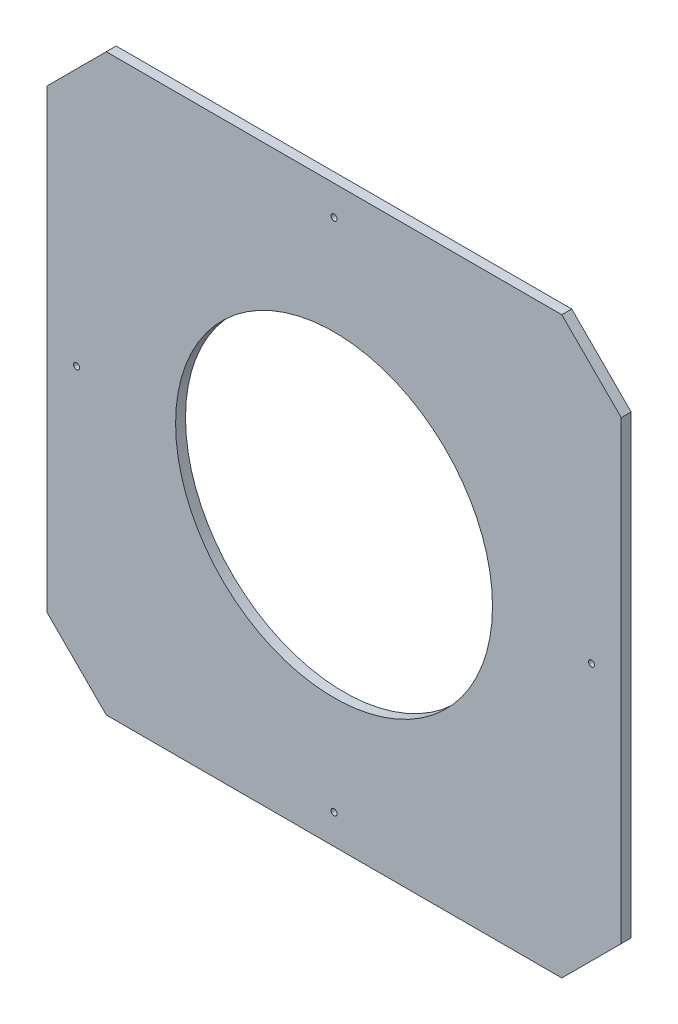
ISO-10303-21;
HEADER;
FILE_DESCRIPTION(('STEP AP214'),'2;1');
FILE_NAME('part.step','',(''),(''),'','','');
FILE_SCHEMA(('AUTOMOTIVE_DESIGN { 1 0 10303 214 1 1 1 1 }'));
ENDSEC;
DATA;
#1=APPLICATION_CONTEXT('core data for automotive mechanical design processes');
#2=APPLICATION_PROTOCOL_DEFINITION('international standard','automotive_design',2000,#1);
#3=PRODUCT_CONTEXT('',#1,'mechanical');
#4=PRODUCT('Part','Part','',(#3));
#5=PRODUCT_RELATED_PRODUCT_CATEGORY('part','',(#4));
#6=PRODUCT_DEFINITION_FORMATION('','',#4);
#7=PRODUCT_DEFINITION_CONTEXT('part definition',#1,'design');
#8=PRODUCT_DEFINITION('design','',#6,#7);
#9=PRODUCT_DEFINITION_SHAPE('','',#8);
#10=(LENGTH_UNIT() NAMED_UNIT(*) SI_UNIT(.MILLI.,.METRE.));
#11=(NAMED_UNIT(*) PLANE_ANGLE_UNIT() SI_UNIT($,.RADIAN.));
#12=(NAMED_UNIT(*) SI_UNIT($,.STERADIAN.) SOLID_ANGLE_UNIT());
#13=UNCERTAINTY_MEASURE_WITH_UNIT(LENGTH_MEASURE(1.E-05),#10,'distance_accuracy_value','');
#14=(GEOMETRIC_REPRESENTATION_CONTEXT(3) GLOBAL_UNCERTAINTY_ASSIGNED_CONTEXT((#13)) GLOBAL_UNIT_ASSIGNED_CONTEXT((#10,
#11,#12)) REPRESENTATION_CONTEXT('',''));
#15=CARTESIAN_POINT('',(0.,0.,0.));
#16=DIRECTION('',(0.,0.,1.));
#17=DIRECTION('',(1.,0.,0.));
#18=AXIS2_PLACEMENT_3D('',#15,#16,#17);
#19=CARTESIAN_POINT('',(-130.,130.,5.));
#20=DIRECTION('',(-0.707106781186548,0.707106781186548,0.));
#21=DIRECTION('',(-0.707106781186548,-0.707106781186548,0.));
#22=AXIS2_PLACEMENT_3D('',#19,#20,#21);
#23=PLANE('',#22);
#24=DIRECTION('',(0.707106781186548,0.707106781186548,0.));
#25=VECTOR('',#24,1.);
#26=CARTESIAN_POINT('',(-130.,130.,0.));
#27=LINE('',#26,#25);
#28=CARTESIAN_POINT('',(-145.,115.,0.));
#29=VERTEX_POINT('',#28);
#30=CARTESIAN_POINT('',(-115.,145.,0.));
#31=VERTEX_POINT('',#30);
#32=EDGE_CURVE('E135',#29,#31,#27,.T.);
#33=ORIENTED_EDGE('',*,*,#32,.F.);
#34=DIRECTION('',(0.,0.,-1.));
#35=VECTOR('',#34,1.);
#36=CARTESIAN_POINT('',(-145.,115.,5.));
#37=LINE('',#36,#35);
#38=CARTESIAN_POINT('',(-145.,115.,5.));
#39=VERTEX_POINT('',#38);
#40=EDGE_CURVE('E11',#39,#29,#37,.T.);
#41=ORIENTED_EDGE('',*,*,#40,.F.);
#42=DIRECTION('',(0.707106781186548,0.707106781186548,0.));
#43=VECTOR('',#42,1.);
#44=CARTESIAN_POINT('',(-130.,130.,5.));
#45=LINE('',#44,#43);
#46=CARTESIAN_POINT('',(-115.,145.,5.));
#47=VERTEX_POINT('',#46);
#48=EDGE_CURVE('E200',#39,#47,#45,.T.);
#49=ORIENTED_EDGE('',*,*,#48,.T.);
#50=DIRECTION('',(0.,0.,-1.));
#51=VECTOR('',#50,1.);
#52=CARTESIAN_POINT('',(-115.,145.,5.));
#53=LINE('',#52,#51);
#54=EDGE_CURVE('E55',#47,#31,#53,.T.);
#55=ORIENTED_EDGE('',*,*,#54,.T.);
#56=EDGE_LOOP('',(#33,#41,#49,#55));
#57=FACE_BOUND('',#56,.T.);
#58=ADVANCED_FACE('F36',(#57),#23,.T.);
#59=CARTESIAN_POINT('',(-145.,0.,5.));
#60=DIRECTION('',(1.,0.,0.));
#61=DIRECTION('',(0.,0.,-1.));
#62=AXIS2_PLACEMENT_3D('',#59,#60,#61);
#63=PLANE('',#62);
#64=DIRECTION('',(0.,-1.,0.));
#65=VECTOR('',#64,1.);
#66=CARTESIAN_POINT('',(-145.,0.,0.));
#67=LINE('',#66,#65);
#68=CARTESIAN_POINT('',(-145.,-115.,0.));
#69=VERTEX_POINT('',#68);
#70=EDGE_CURVE('E138',#29,#69,#67,.T.);
#71=ORIENTED_EDGE('',*,*,#70,.T.);
#72=DIRECTION('',(0.,0.,-1.));
#73=VECTOR('',#72,1.);
#74=CARTESIAN_POINT('',(-145.,-115.,5.));
#75=LINE('',#74,#73);
#76=CARTESIAN_POINT('',(-145.,-115.,5.));
#77=VERTEX_POINT('',#76);
#78=EDGE_CURVE('E46',#77,#69,#75,.T.);
#79=ORIENTED_EDGE('',*,*,#78,.F.);
#80=DIRECTION('',(0.,-1.,0.));
#81=VECTOR('',#80,1.);
#82=CARTESIAN_POINT('',(-145.,0.,5.));
#83=LINE('',#82,#81);
#84=EDGE_CURVE('E202',#39,#77,#83,.T.);
#85=ORIENTED_EDGE('',*,*,#84,.F.);
#86=ORIENTED_EDGE('',*,*,#40,.T.);
#87=EDGE_LOOP('',(#71,#79,#85,#86));
#88=FACE_BOUND('',#87,.T.);
#89=ADVANCED_FACE('F231',(#88),#63,.F.);
#90=CARTESIAN_POINT('',(-130.,-130.,5.));
#91=DIRECTION('',(0.707106781186548,0.707106781186548,0.));
#92=DIRECTION('',(-0.707106781186548,0.707106781186548,0.));
#93=AXIS2_PLACEMENT_3D('',#90,#91,#92);
#94=PLANE('',#93);
#95=DIRECTION('',(0.707106781186548,-0.707106781186548,0.));
#96=VECTOR('',#95,1.);
#97=CARTESIAN_POINT('',(-130.,-130.,0.));
#98=LINE('',#97,#96);
#99=CARTESIAN_POINT('',(-115.,-145.,0.));
#100=VERTEX_POINT('',#99);
#101=EDGE_CURVE('E141',#69,#100,#98,.T.);
#102=ORIENTED_EDGE('',*,*,#101,.T.);
#103=DIRECTION('',(0.,0.,-1.));
#104=VECTOR('',#103,1.);
#105=CARTESIAN_POINT('',(-115.,-145.,5.));
#106=LINE('',#105,#104);
#107=CARTESIAN_POINT('',(-115.,-145.,5.));
#108=VERTEX_POINT('',#107);
#109=EDGE_CURVE('E163',#108,#100,#106,.T.);
#110=ORIENTED_EDGE('',*,*,#109,.F.);
#111=DIRECTION('',(0.707106781186548,-0.707106781186548,0.));
#112=VECTOR('',#111,1.);
#113=CARTESIAN_POINT('',(-130.,-130.,5.));
#114=LINE('',#113,#112);
#115=EDGE_CURVE('E205',#77,#108,#114,.T.);
#116=ORIENTED_EDGE('',*,*,#115,.F.);
#117=ORIENTED_EDGE('',*,*,#78,.T.);
#118=EDGE_LOOP('',(#102,#110,#116,#117));
#119=FACE_BOUND('',#118,.T.);
#120=ADVANCED_FACE('F235',(#119),#94,.F.);
#121=CARTESIAN_POINT('',(0.,-145.,5.));
#122=DIRECTION('',(0.,1.,0.));
#123=DIRECTION('',(0.,0.,1.));
#124=AXIS2_PLACEMENT_3D('',#121,#122,#123);
#125=PLANE('',#124);
#126=DIRECTION('',(1.,0.,0.));
#127=VECTOR('',#126,1.);
#128=CARTESIAN_POINT('',(0.,-145.,0.));
#129=LINE('',#128,#127);
#130=CARTESIAN_POINT('',(115.,-145.,0.));
#131=VERTEX_POINT('',#130);
#132=EDGE_CURVE('E144',#100,#131,#129,.T.);
#133=ORIENTED_EDGE('',*,*,#132,.T.);
#134=DIRECTION('',(0.,0.,-1.));
#135=VECTOR('',#134,1.);
#136=CARTESIAN_POINT('',(115.,-145.,5.));
#137=LINE('',#136,#135);
#138=CARTESIAN_POINT('',(115.,-145.,5.));
#139=VERTEX_POINT('',#138);
#140=EDGE_CURVE('E160',#139,#131,#137,.T.);
#141=ORIENTED_EDGE('',*,*,#140,.F.);
#142=DIRECTION('',(1.,0.,0.));
#143=VECTOR('',#142,1.);
#144=CARTESIAN_POINT('',(0.,-145.,5.));
#145=LINE('',#144,#143);
#146=EDGE_CURVE('E208',#108,#139,#145,.T.);
#147=ORIENTED_EDGE('',*,*,#146,.F.);
#148=ORIENTED_EDGE('',*,*,#109,.T.);
#149=EDGE_LOOP('',(#133,#141,#147,#148));
#150=FACE_BOUND('',#149,.T.);
#151=ADVANCED_FACE('F212',(#150),#125,.F.);
#152=CARTESIAN_POINT('',(130.,-130.,5.));
#153=DIRECTION('',(-0.707106781186548,0.707106781186548,0.));
#154=DIRECTION('',(-0.707106781186548,-0.707106781186548,0.));
#155=AXIS2_PLACEMENT_3D('',#152,#153,#154);
#156=PLANE('',#155);
#157=DIRECTION('',(0.707106781186548,0.707106781186548,0.));
#158=VECTOR('',#157,1.);
#159=CARTESIAN_POINT('',(130.,-130.,0.));
#160=LINE('',#159,#158);
#161=CARTESIAN_POINT('',(145.,-115.,0.));
#162=VERTEX_POINT('',#161);
#163=EDGE_CURVE('E147',#131,#162,#160,.T.);
#164=ORIENTED_EDGE('',*,*,#163,.T.);
#165=DIRECTION('',(0.,0.,-1.));
#166=VECTOR('',#165,1.);
#167=CARTESIAN_POINT('',(145.,-115.,5.));
#168=LINE('',#167,#166);
#169=CARTESIAN_POINT('',(145.,-115.,5.));
#170=VERTEX_POINT('',#169);
#171=EDGE_CURVE('E114',#170,#162,#168,.T.);
#172=ORIENTED_EDGE('',*,*,#171,.F.);
#173=DIRECTION('',(0.707106781186548,0.707106781186548,0.));
#174=VECTOR('',#173,1.);
#175=CARTESIAN_POINT('',(130.,-130.,5.));
#176=LINE('',#175,#174);
#177=EDGE_CURVE('E123',#139,#170,#176,.T.);
#178=ORIENTED_EDGE('',*,*,#177,.F.);
#179=ORIENTED_EDGE('',*,*,#140,.T.);
#180=EDGE_LOOP('',(#164,#172,#178,#179));
#181=FACE_BOUND('',#180,.T.);
#182=ADVANCED_FACE('F214',(#181),#156,.F.);
#183=CARTESIAN_POINT('',(145.,0.,5.));
#184=DIRECTION('',(1.,0.,0.));
#185=DIRECTION('',(0.,1.,0.));
#186=AXIS2_PLACEMENT_3D('',#183,#184,#185);
#187=PLANE('',#186);
#188=DIRECTION('',(0.,-1.,0.));
#189=VECTOR('',#188,1.);
#190=CARTESIAN_POINT('',(145.,0.,0.));
#191=LINE('',#190,#189);
#192=CARTESIAN_POINT('',(145.,115.,0.));
#193=VERTEX_POINT('',#192);
#194=EDGE_CURVE('E110',#193,#162,#191,.T.);
#195=ORIENTED_EDGE('',*,*,#194,.F.);
#196=DIRECTION('',(0.,0.,-1.));
#197=VECTOR('',#196,1.);
#198=CARTESIAN_POINT('',(145.,115.,5.));
#199=LINE('',#198,#197);
#200=CARTESIAN_POINT('',(145.,115.,5.));
#201=VERTEX_POINT('',#200);
#202=EDGE_CURVE('E105',#201,#193,#199,.T.);
#203=ORIENTED_EDGE('',*,*,#202,.F.);
#204=DIRECTION('',(0.,-1.,0.));
#205=VECTOR('',#204,1.);
#206=CARTESIAN_POINT('',(145.,0.,5.));
#207=LINE('',#206,#205);
#208=EDGE_CURVE('E108',#201,#170,#207,.T.);
#209=ORIENTED_EDGE('',*,*,#208,.T.);
#210=ORIENTED_EDGE('',*,*,#171,.T.);
#211=EDGE_LOOP('',(#195,#203,#209,#210));
#212=FACE_BOUND('',#211,.T.);
#213=ADVANCED_FACE('F107',(#212),#187,.T.);
#214=CARTESIAN_POINT('',(130.,130.,5.));
#215=DIRECTION('',(0.707106781186548,0.707106781186548,0.));
#216=DIRECTION('',(-0.707106781186548,0.707106781186548,0.));
#217=AXIS2_PLACEMENT_3D('',#214,#215,#216);
#218=PLANE('',#217);
#219=DIRECTION('',(0.707106781186548,-0.707106781186548,0.));
#220=VECTOR('',#219,1.);
#221=CARTESIAN_POINT('',(130.,130.,0.));
#222=LINE('',#221,#220);
#223=CARTESIAN_POINT('',(115.,145.,0.));
#224=VERTEX_POINT('',#223);
#225=EDGE_CURVE('E151',#224,#193,#222,.T.);
#226=ORIENTED_EDGE('',*,*,#225,.F.);
#227=DIRECTION('',(0.,0.,-1.));
#228=VECTOR('',#227,1.);
#229=CARTESIAN_POINT('',(115.,145.,5.));
#230=LINE('',#229,#228);
#231=CARTESIAN_POINT('',(115.,145.,5.));
#232=VERTEX_POINT('',#231);
#233=EDGE_CURVE('E80',#232,#224,#230,.T.);
#234=ORIENTED_EDGE('',*,*,#233,.F.);
#235=DIRECTION('',(0.707106781186548,-0.707106781186548,0.));
#236=VECTOR('',#235,1.);
#237=CARTESIAN_POINT('',(130.,130.,5.));
#238=LINE('',#237,#236);
#239=EDGE_CURVE('E121',#232,#201,#238,.T.);
#240=ORIENTED_EDGE('',*,*,#239,.T.);
#241=ORIENTED_EDGE('',*,*,#202,.T.);
#242=EDGE_LOOP('',(#226,#234,#240,#241));
#243=FACE_BOUND('',#242,.T.);
#244=ADVANCED_FACE('F126',(#243),#218,.T.);
#245=CARTESIAN_POINT('',(0.,0.,5.));
#246=DIRECTION('',(0.,0.,-1.));
#247=DIRECTION('',(-1.,0.,0.));
#248=AXIS2_PLACEMENT_3D('',#245,#246,#247);
#249=CYLINDRICAL_SURFACE('',#248,80.);
#250=CARTESIAN_POINT('',(0.,0.,5.));
#251=DIRECTION('',(0.,0.,1.));
#252=DIRECTION('',(1.,0.,0.));
#253=AXIS2_PLACEMENT_3D('',#250,#251,#252);
#254=CIRCLE('',#253,80.);
#255=CARTESIAN_POINT('',(80.,0.,5.));
#256=VERTEX_POINT('',#255);
#257=EDGE_CURVE('E156',#256,#256,#254,.T.);
#258=ORIENTED_EDGE('',*,*,#257,.T.);
#259=EDGE_LOOP('',(#258));
#260=FACE_BOUND('',#259,.T.);
#261=CARTESIAN_POINT('',(0.,0.,0.));
#262=DIRECTION('',(0.,0.,1.));
#263=DIRECTION('',(1.,0.,0.));
#264=AXIS2_PLACEMENT_3D('',#261,#262,#263);
#265=CIRCLE('',#264,80.);
#266=CARTESIAN_POINT('',(80.,0.,0.));
#267=VERTEX_POINT('',#266);
#268=EDGE_CURVE('E132',#267,#267,#265,.T.);
#269=ORIENTED_EDGE('',*,*,#268,.F.);
#270=EDGE_LOOP('',(#269));
#271=FACE_BOUND('',#270,.T.);
#272=ADVANCED_FACE('F38',(#260,#271),#249,.F.);
#273=CARTESIAN_POINT('',(0.,145.,5.));
#274=DIRECTION('',(0.,1.,0.));
#275=DIRECTION('',(0.,0.,1.));
#276=AXIS2_PLACEMENT_3D('',#273,#274,#275);
#277=PLANE('',#276);
#278=DIRECTION('',(1.,0.,0.));
#279=VECTOR('',#278,1.);
#280=CARTESIAN_POINT('',(0.,145.,0.));
#281=LINE('',#280,#279);
#282=EDGE_CURVE('E153',#31,#224,#281,.T.);
#283=ORIENTED_EDGE('',*,*,#282,.F.);
#284=ORIENTED_EDGE('',*,*,#54,.F.);
#285=DIRECTION('',(1.,0.,0.));
#286=VECTOR('',#285,1.);
#287=CARTESIAN_POINT('',(0.,145.,5.));
#288=LINE('',#287,#286);
#289=EDGE_CURVE('E127',#47,#232,#288,.T.);
#290=ORIENTED_EDGE('',*,*,#289,.T.);
#291=ORIENTED_EDGE('',*,*,#233,.T.);
#292=EDGE_LOOP('',(#283,#284,#290,#291));
#293=FACE_BOUND('',#292,.T.);
#294=ADVANCED_FACE('F218',(#293),#277,.T.);
#295=CARTESIAN_POINT('',(0.,0.,5.));
#296=DIRECTION('',(0.,0.,1.));
#297=DIRECTION('',(1.,0.,0.));
#298=AXIS2_PLACEMENT_3D('',#295,#296,#297);
#299=PLANE('',#298);
#300=CARTESIAN_POINT('',(0.,130.,5.));
#301=DIRECTION('',(0.,0.,1.));
#302=DIRECTION('',(1.,0.,0.));
#303=AXIS2_PLACEMENT_3D('',#300,#301,#302);
#304=CIRCLE('',#303,1.525);
#305=CARTESIAN_POINT('',(1.525,130.,5.));
#306=VERTEX_POINT('',#305);
#307=EDGE_CURVE('E368',#306,#306,#304,.T.);
#308=ORIENTED_EDGE('',*,*,#307,.F.);
#309=EDGE_LOOP('',(#308));
#310=FACE_BOUND('',#309,.T.);
#311=CARTESIAN_POINT('',(130.000000000007,7.36576383932167E-12,5.));
#312=DIRECTION('',(0.,0.,1.));
#313=DIRECTION('',(1.,0.,0.));
#314=AXIS2_PLACEMENT_3D('',#311,#312,#313);
#315=CIRCLE('',#314,1.525);
#316=CARTESIAN_POINT('',(131.525000000007,7.36576383932167E-12,5.));
#317=VERTEX_POINT('',#316);
#318=EDGE_CURVE('E184',#317,#317,#315,.T.);
#319=ORIENTED_EDGE('',*,*,#318,.F.);
#320=EDGE_LOOP('',(#319));
#321=FACE_BOUND('',#320,.T.);
#322=CARTESIAN_POINT('',(1.47315276786433E-11,-130.,5.));
#323=DIRECTION('',(0.,0.,1.));
#324=DIRECTION('',(1.,0.,0.));
#325=AXIS2_PLACEMENT_3D('',#322,#323,#324);
#326=CIRCLE('',#325,1.525);
#327=CARTESIAN_POINT('',(1.52500000001473,-130.,5.));
#328=VERTEX_POINT('',#327);
#329=EDGE_CURVE('E177',#328,#328,#326,.T.);
#330=ORIENTED_EDGE('',*,*,#329,.F.);
#331=EDGE_LOOP('',(#330));
#332=FACE_BOUND('',#331,.T.);
#333=CARTESIAN_POINT('',(-129.999999999993,-7.34984343093275E-12,5.));
#334=DIRECTION('',(0.,0.,1.));
#335=DIRECTION('',(1.,0.,0.));
#336=AXIS2_PLACEMENT_3D('',#333,#334,#335);
#337=CIRCLE('',#336,1.525);
#338=CARTESIAN_POINT('',(-128.474999999993,-7.34984343093275E-12,5.));
#339=VERTEX_POINT('',#338);
#340=EDGE_CURVE('E173',#339,#339,#337,.T.);
#341=ORIENTED_EDGE('',*,*,#340,.F.);
#342=EDGE_LOOP('',(#341));
#343=FACE_BOUND('',#342,.T.);
#344=ORIENTED_EDGE('',*,*,#257,.F.);
#345=EDGE_LOOP('',(#344));
#346=FACE_BOUND('',#345,.T.);
#347=ORIENTED_EDGE('',*,*,#48,.F.);
#348=ORIENTED_EDGE('',*,*,#84,.T.);
#349=ORIENTED_EDGE('',*,*,#115,.T.);
#350=ORIENTED_EDGE('',*,*,#146,.T.);
#351=ORIENTED_EDGE('',*,*,#177,.T.);
#352=ORIENTED_EDGE('',*,*,#208,.F.);
#353=ORIENTED_EDGE('',*,*,#239,.F.);
#354=ORIENTED_EDGE('',*,*,#289,.F.);
#355=EDGE_LOOP('',(#347,#348,#349,#350,#351,#352,#353,#354));
#356=FACE_BOUND('',#355,.T.);
#357=ADVANCED_FACE('F119',(#310,#321,#332,#343,#346,#356),#299,.T.);
#358=CARTESIAN_POINT('',(0.,0.,0.));
#359=DIRECTION('',(0.,0.,1.));
#360=DIRECTION('',(1.,0.,0.));
#361=AXIS2_PLACEMENT_3D('',#358,#359,#360);
#362=PLANE('',#361);
#363=CARTESIAN_POINT('',(0.,130.,0.));
#364=DIRECTION('',(0.,0.,1.));
#365=DIRECTION('',(1.,0.,0.));
#366=AXIS2_PLACEMENT_3D('',#363,#364,#365);
#367=CIRCLE('',#366,1.5);
#368=CARTESIAN_POINT('',(1.5,130.,0.));
#369=VERTEX_POINT('',#368);
#370=EDGE_CURVE('E40',#369,#369,#367,.T.);
#371=ORIENTED_EDGE('',*,*,#370,.T.);
#372=EDGE_LOOP('',(#371));
#373=FACE_BOUND('',#372,.T.);
#374=CARTESIAN_POINT('',(130.000000000007,7.36576383932167E-12,0.));
#375=DIRECTION('',(0.,0.,1.));
#376=DIRECTION('',(1.,0.,0.));
#377=AXIS2_PLACEMENT_3D('',#374,#375,#376);
#378=CIRCLE('',#377,1.5);
#379=CARTESIAN_POINT('',(131.500000000007,7.36576383932167E-12,0.));
#380=VERTEX_POINT('',#379);
#381=EDGE_CURVE('E175',#380,#380,#378,.T.);
#382=ORIENTED_EDGE('',*,*,#381,.T.);
#383=EDGE_LOOP('',(#382));
#384=FACE_BOUND('',#383,.T.);
#385=CARTESIAN_POINT('',(1.47315276786433E-11,-130.,0.));
#386=DIRECTION('',(0.,0.,1.));
#387=DIRECTION('',(1.,0.,0.));
#388=AXIS2_PLACEMENT_3D('',#385,#386,#387);
#389=CIRCLE('',#388,1.5);
#390=CARTESIAN_POINT('',(1.50000000001473,-130.,0.));
#391=VERTEX_POINT('',#390);
#392=EDGE_CURVE('E171',#391,#391,#389,.T.);
#393=ORIENTED_EDGE('',*,*,#392,.T.);
#394=EDGE_LOOP('',(#393));
#395=FACE_BOUND('',#394,.T.);
#396=CARTESIAN_POINT('',(-129.999999999993,-7.34984343093275E-12,0.));
#397=DIRECTION('',(0.,0.,1.));
#398=DIRECTION('',(1.,0.,0.));
#399=AXIS2_PLACEMENT_3D('',#396,#397,#398);
#400=CIRCLE('',#399,1.5);
#401=CARTESIAN_POINT('',(-128.499999999993,-7.34984343093275E-12,0.));
#402=VERTEX_POINT('',#401);
#403=EDGE_CURVE('E136',#402,#402,#400,.T.);
#404=ORIENTED_EDGE('',*,*,#403,.T.);
#405=EDGE_LOOP('',(#404));
#406=FACE_BOUND('',#405,.T.);
#407=ORIENTED_EDGE('',*,*,#268,.T.);
#408=EDGE_LOOP('',(#407));
#409=FACE_BOUND('',#408,.T.);
#410=ORIENTED_EDGE('',*,*,#32,.T.);
#411=ORIENTED_EDGE('',*,*,#282,.T.);
#412=ORIENTED_EDGE('',*,*,#225,.T.);
#413=ORIENTED_EDGE('',*,*,#194,.T.);
#414=ORIENTED_EDGE('',*,*,#163,.F.);
#415=ORIENTED_EDGE('',*,*,#132,.F.);
#416=ORIENTED_EDGE('',*,*,#101,.F.);
#417=ORIENTED_EDGE('',*,*,#70,.F.);
#418=EDGE_LOOP('',(#410,#411,#412,#413,#414,#415,#416,#417));
#419=FACE_BOUND('',#418,.T.);
#420=ADVANCED_FACE('F216',(#373,#384,#395,#406,#409,#419),#362,.F.);
#421=CARTESIAN_POINT('',(-129.999999999993,-7.34984343093275E-12,5.));
#422=DIRECTION('',(0.,0.,1.));
#423=DIRECTION('',(1.,0.,0.));
#424=AXIS2_PLACEMENT_3D('',#421,#422,#423);
#425=CYLINDRICAL_SURFACE('',#424,1.5);
#426=CARTESIAN_POINT('',(-129.999999999993,-7.34984343093275E-12,4.975));
#427=DIRECTION('',(0.,0.,1.));
#428=DIRECTION('',(1.,0.,0.));
#429=AXIS2_PLACEMENT_3D('',#426,#427,#428);
#430=CIRCLE('',#429,1.5);
#431=CARTESIAN_POINT('',(-128.499999999993,-7.34984343093275E-12,4.975));
#432=VERTEX_POINT('',#431);
#433=EDGE_CURVE('E170',#432,#432,#430,.T.);
#434=ORIENTED_EDGE('',*,*,#433,.T.);
#435=EDGE_LOOP('',(#434));
#436=FACE_BOUND('',#435,.T.);
#437=ORIENTED_EDGE('',*,*,#403,.F.);
#438=EDGE_LOOP('',(#437));
#439=FACE_BOUND('',#438,.T.);
#440=ADVANCED_FACE('F275',(#436,#439),#425,.F.);
#441=CARTESIAN_POINT('',(-129.999999999993,-7.34984343093275E-12,5.));
#442=DIRECTION('',(0.,0.,1.));
#443=DIRECTION('',(1.,0.,0.));
#444=AXIS2_PLACEMENT_3D('',#441,#442,#443);
#445=CONICAL_SURFACE('',#444,1.525,0.785398163397292);
#446=ORIENTED_EDGE('',*,*,#433,.F.);
#447=EDGE_LOOP('',(#446));
#448=FACE_BOUND('',#447,.T.);
#449=ORIENTED_EDGE('',*,*,#340,.T.);
#450=EDGE_LOOP('',(#449));
#451=FACE_BOUND('',#450,.T.);
#452=ADVANCED_FACE('F285',(#448,#451),#445,.F.);
#453=CARTESIAN_POINT('',(1.47315276786433E-11,-130.,5.));
#454=DIRECTION('',(0.,0.,1.));
#455=DIRECTION('',(1.,0.,0.));
#456=AXIS2_PLACEMENT_3D('',#453,#454,#455);
#457=CYLINDRICAL_SURFACE('',#456,1.5);
#458=CARTESIAN_POINT('',(1.47315276786433E-11,-130.,4.975));
#459=DIRECTION('',(0.,0.,1.));
#460=DIRECTION('',(1.,0.,0.));
#461=AXIS2_PLACEMENT_3D('',#458,#459,#460);
#462=CIRCLE('',#461,1.5);
#463=CARTESIAN_POINT('',(1.50000000001473,-130.,4.975));
#464=VERTEX_POINT('',#463);
#465=EDGE_CURVE('E174',#464,#464,#462,.T.);
#466=ORIENTED_EDGE('',*,*,#465,.T.);
#467=EDGE_LOOP('',(#466));
#468=FACE_BOUND('',#467,.T.);
#469=ORIENTED_EDGE('',*,*,#392,.F.);
#470=EDGE_LOOP('',(#469));
#471=FACE_BOUND('',#470,.T.);
#472=ADVANCED_FACE('F296',(#468,#471),#457,.F.);
#473=CARTESIAN_POINT('',(1.47315276786433E-11,-130.,5.));
#474=DIRECTION('',(0.,0.,1.));
#475=DIRECTION('',(1.,0.,0.));
#476=AXIS2_PLACEMENT_3D('',#473,#474,#475);
#477=CONICAL_SURFACE('',#476,1.525,0.78539816339737);
#478=ORIENTED_EDGE('',*,*,#465,.F.);
#479=EDGE_LOOP('',(#478));
#480=FACE_BOUND('',#479,.T.);
#481=ORIENTED_EDGE('',*,*,#329,.T.);
#482=EDGE_LOOP('',(#481));
#483=FACE_BOUND('',#482,.T.);
#484=ADVANCED_FACE('F306',(#480,#483),#477,.F.);
#485=CARTESIAN_POINT('',(130.000000000007,7.36576383932167E-12,5.));
#486=DIRECTION('',(0.,0.,1.));
#487=DIRECTION('',(1.,0.,0.));
#488=AXIS2_PLACEMENT_3D('',#485,#486,#487);
#489=CYLINDRICAL_SURFACE('',#488,1.5);
#490=CARTESIAN_POINT('',(130.000000000007,7.36576383932167E-12,4.975));
#491=DIRECTION('',(0.,0.,1.));
#492=DIRECTION('',(1.,0.,0.));
#493=AXIS2_PLACEMENT_3D('',#490,#491,#492);
#494=CIRCLE('',#493,1.5);
#495=CARTESIAN_POINT('',(131.500000000007,7.36576383932167E-12,4.975));
#496=VERTEX_POINT('',#495);
#497=EDGE_CURVE('E178',#496,#496,#494,.T.);
#498=ORIENTED_EDGE('',*,*,#497,.T.);
#499=EDGE_LOOP('',(#498));
#500=FACE_BOUND('',#499,.T.);
#501=ORIENTED_EDGE('',*,*,#381,.F.);
#502=EDGE_LOOP('',(#501));
#503=FACE_BOUND('',#502,.T.);
#504=ADVANCED_FACE('F317',(#500,#503),#489,.F.);
#505=CARTESIAN_POINT('',(130.000000000007,7.36576383932167E-12,5.));
#506=DIRECTION('',(0.,0.,1.));
#507=DIRECTION('',(1.,0.,0.));
#508=AXIS2_PLACEMENT_3D('',#505,#506,#507);
#509=CONICAL_SURFACE('',#508,1.525,0.785398163397292);
#510=ORIENTED_EDGE('',*,*,#497,.F.);
#511=EDGE_LOOP('',(#510));
#512=FACE_BOUND('',#511,.T.);
#513=ORIENTED_EDGE('',*,*,#318,.T.);
#514=EDGE_LOOP('',(#513));
#515=FACE_BOUND('',#514,.T.);
#516=ADVANCED_FACE('F327',(#512,#515),#509,.F.);
#517=CARTESIAN_POINT('',(0.,130.,5.));
#518=DIRECTION('',(0.,0.,1.));
#519=DIRECTION('',(1.,0.,0.));
#520=AXIS2_PLACEMENT_3D('',#517,#518,#519);
#521=CYLINDRICAL_SURFACE('',#520,1.5);
#522=CARTESIAN_POINT('',(0.,130.,4.975));
#523=DIRECTION('',(0.,0.,1.));
#524=DIRECTION('',(1.,0.,0.));
#525=AXIS2_PLACEMENT_3D('',#522,#523,#524);
#526=CIRCLE('',#525,1.5);
#527=CARTESIAN_POINT('',(1.5,130.,4.975));
#528=VERTEX_POINT('',#527);
#529=EDGE_CURVE('E365',#528,#528,#526,.T.);
#530=ORIENTED_EDGE('',*,*,#529,.T.);
#531=EDGE_LOOP('',(#530));
#532=FACE_BOUND('',#531,.T.);
#533=ORIENTED_EDGE('',*,*,#370,.F.);
#534=EDGE_LOOP('',(#533));
#535=FACE_BOUND('',#534,.T.);
#536=ADVANCED_FACE('F337',(#532,#535),#521,.F.);
#537=CARTESIAN_POINT('',(0.,130.,5.));
#538=DIRECTION('',(0.,0.,1.));
#539=DIRECTION('',(1.,0.,0.));
#540=AXIS2_PLACEMENT_3D('',#537,#538,#539);
#541=CONICAL_SURFACE('',#540,1.525,0.78539816339737);
#542=ORIENTED_EDGE('',*,*,#529,.F.);
#543=EDGE_LOOP('',(#542));
#544=FACE_BOUND('',#543,.T.);
#545=ORIENTED_EDGE('',*,*,#307,.T.);
#546=EDGE_LOOP('',(#545));
#547=FACE_BOUND('',#546,.T.);
#548=ADVANCED_FACE('F347',(#544,#547),#541,.F.);
#549=CLOSED_SHELL('',(#58,#89,#120,#151,#182,#213,#244,#272,#294,#357,#420,#440,#452,#472,#484,
#504,#516,#536,#548));
#550=MANIFOLD_SOLID_BREP('B2',#549);
#551=ADVANCED_BREP_SHAPE_REPRESENTATION('',(#18,#550),#14);
#552=SHAPE_DEFINITION_REPRESENTATION(#9,#551);
ENDSEC;
END-ISO-10303-21;
